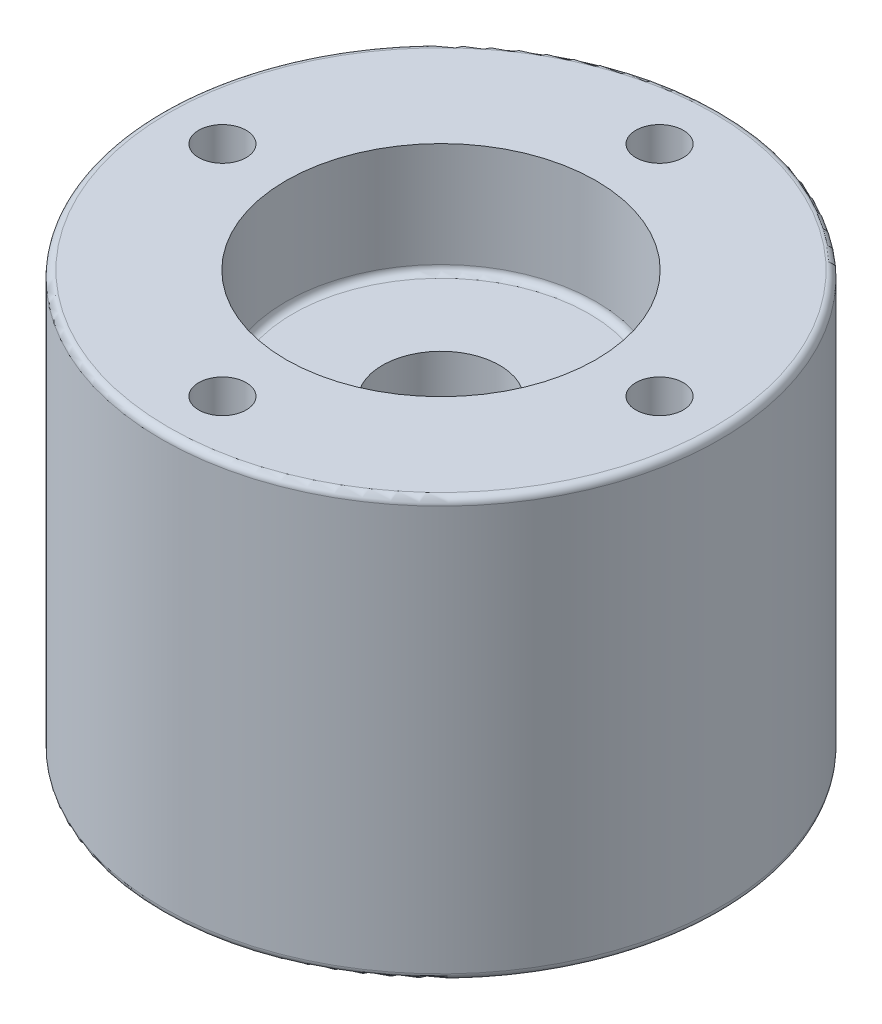
ISO-10303-21;
HEADER;
FILE_DESCRIPTION(('STEP AP214'),'2;1');
FILE_NAME('part.step','',(''),(''),'','','');
FILE_SCHEMA(('AUTOMOTIVE_DESIGN { 1 0 10303 214 1 1 1 1 }'));
ENDSEC;
DATA;
#1=APPLICATION_CONTEXT('core data for automotive mechanical design processes');
#2=APPLICATION_PROTOCOL_DEFINITION('international standard','automotive_design',2000,#1);
#3=PRODUCT_CONTEXT('',#1,'mechanical');
#4=PRODUCT('Part','Part','',(#3));
#5=PRODUCT_RELATED_PRODUCT_CATEGORY('part','',(#4));
#6=PRODUCT_DEFINITION_FORMATION('','',#4);
#7=PRODUCT_DEFINITION_CONTEXT('part definition',#1,'design');
#8=PRODUCT_DEFINITION('design','',#6,#7);
#9=PRODUCT_DEFINITION_SHAPE('','',#8);
#10=(LENGTH_UNIT() NAMED_UNIT(*) SI_UNIT(.MILLI.,.METRE.));
#11=(NAMED_UNIT(*) PLANE_ANGLE_UNIT() SI_UNIT($,.RADIAN.));
#12=(NAMED_UNIT(*) SI_UNIT($,.STERADIAN.) SOLID_ANGLE_UNIT());
#13=UNCERTAINTY_MEASURE_WITH_UNIT(LENGTH_MEASURE(1.E-05),#10,'distance_accuracy_value','');
#14=(GEOMETRIC_REPRESENTATION_CONTEXT(3) GLOBAL_UNCERTAINTY_ASSIGNED_CONTEXT((#13)) GLOBAL_UNIT_ASSIGNED_CONTEXT((#10,
#11,#12)) REPRESENTATION_CONTEXT('',''));
#15=CARTESIAN_POINT('',(0.,0.,0.));
#16=DIRECTION('',(0.,0.,1.));
#17=DIRECTION('',(1.,0.,0.));
#18=AXIS2_PLACEMENT_3D('',#15,#16,#17);
#19=CARTESIAN_POINT('',(0.,30.,0.));
#20=DIRECTION('',(0.,-1.,0.));
#21=DIRECTION('',(0.,0.,-1.));
#22=AXIS2_PLACEMENT_3D('',#19,#20,#21);
#23=CYLINDRICAL_SURFACE('',#22,20.);
#24=CARTESIAN_POINT('',(0.,0.5,0.));
#25=DIRECTION('',(0.,1.,0.));
#26=DIRECTION('',(0.,0.,1.));
#27=AXIS2_PLACEMENT_3D('',#24,#25,#26);
#28=CIRCLE('',#27,20.);
#29=CARTESIAN_POINT('',(0.,0.5,20.));
#30=VERTEX_POINT('',#29);
#31=EDGE_CURVE('E62',#30,#30,#28,.T.);
#32=ORIENTED_EDGE('',*,*,#31,.T.);
#33=EDGE_LOOP('',(#32));
#34=FACE_BOUND('',#33,.T.);
#35=CARTESIAN_POINT('',(0.,29.5,0.));
#36=DIRECTION('',(0.,1.,0.));
#37=DIRECTION('',(0.,0.,1.));
#38=AXIS2_PLACEMENT_3D('',#35,#36,#37);
#39=CIRCLE('',#38,20.);
#40=CARTESIAN_POINT('',(0.,29.5,20.));
#41=VERTEX_POINT('',#40);
#42=EDGE_CURVE('E65',#41,#41,#39,.F.);
#43=ORIENTED_EDGE('',*,*,#42,.T.);
#44=EDGE_LOOP('',(#43));
#45=FACE_BOUND('',#44,.T.);
#46=ADVANCED_FACE('F36',(#34,#45),#23,.T.);
#47=CARTESIAN_POINT('',(0.,30.,0.));
#48=DIRECTION('',(0.,1.,0.));
#49=DIRECTION('',(0.,0.,1.));
#50=AXIS2_PLACEMENT_3D('',#47,#48,#49);
#51=PLANE('',#50);
#52=CARTESIAN_POINT('',(0.,30.,0.));
#53=DIRECTION('',(0.,1.,0.));
#54=DIRECTION('',(0.,0.,1.));
#55=AXIS2_PLACEMENT_3D('',#52,#53,#54);
#56=CIRCLE('',#55,19.5);
#57=CARTESIAN_POINT('',(0.,30.,19.5));
#58=VERTEX_POINT('',#57);
#59=EDGE_CURVE('E51',#58,#58,#56,.T.);
#60=ORIENTED_EDGE('',*,*,#59,.T.);
#61=EDGE_LOOP('',(#60));
#62=FACE_BOUND('',#61,.T.);
#63=CARTESIAN_POINT('',(0.,30.,-15.65));
#64=DIRECTION('',(0.,1.,0.));
#65=DIRECTION('',(0.,0.,1.));
#66=AXIS2_PLACEMENT_3D('',#63,#64,#65);
#67=CIRCLE('',#66,1.7);
#68=CARTESIAN_POINT('',(0.,30.,-13.95));
#69=VERTEX_POINT('',#68);
#70=EDGE_CURVE('E100',#69,#69,#67,.T.);
#71=ORIENTED_EDGE('',*,*,#70,.F.);
#72=EDGE_LOOP('',(#71));
#73=FACE_BOUND('',#72,.T.);
#74=CARTESIAN_POINT('',(-15.65,30.,0.));
#75=DIRECTION('',(0.,1.,0.));
#76=DIRECTION('',(0.,0.,1.));
#77=AXIS2_PLACEMENT_3D('',#74,#75,#76);
#78=CIRCLE('',#77,1.7);
#79=CARTESIAN_POINT('',(-15.65,30.,1.7));
#80=VERTEX_POINT('',#79);
#81=EDGE_CURVE('E97',#80,#80,#78,.T.);
#82=ORIENTED_EDGE('',*,*,#81,.F.);
#83=EDGE_LOOP('',(#82));
#84=FACE_BOUND('',#83,.T.);
#85=CARTESIAN_POINT('',(0.,30.,15.65));
#86=DIRECTION('',(0.,1.,0.));
#87=DIRECTION('',(0.,0.,1.));
#88=AXIS2_PLACEMENT_3D('',#85,#86,#87);
#89=CIRCLE('',#88,1.7);
#90=CARTESIAN_POINT('',(0.,30.,17.35));
#91=VERTEX_POINT('',#90);
#92=EDGE_CURVE('E91',#91,#91,#89,.T.);
#93=ORIENTED_EDGE('',*,*,#92,.F.);
#94=EDGE_LOOP('',(#93));
#95=FACE_BOUND('',#94,.T.);
#96=CARTESIAN_POINT('',(15.65,30.,0.));
#97=DIRECTION('',(0.,1.,0.));
#98=DIRECTION('',(0.,0.,1.));
#99=AXIS2_PLACEMENT_3D('',#96,#97,#98);
#100=CIRCLE('',#99,1.7);
#101=CARTESIAN_POINT('',(15.65,30.,1.7));
#102=VERTEX_POINT('',#101);
#103=EDGE_CURVE('E85',#102,#102,#100,.T.);
#104=ORIENTED_EDGE('',*,*,#103,.F.);
#105=EDGE_LOOP('',(#104));
#106=FACE_BOUND('',#105,.T.);
#107=CARTESIAN_POINT('',(0.,30.,0.));
#108=DIRECTION('',(0.,1.,0.));
#109=DIRECTION('',(0.,0.,1.));
#110=AXIS2_PLACEMENT_3D('',#107,#108,#109);
#111=CIRCLE('',#110,11.1);
#112=CARTESIAN_POINT('',(0.,30.,11.1));
#113=VERTEX_POINT('',#112);
#114=EDGE_CURVE('E74',#113,#113,#111,.T.);
#115=ORIENTED_EDGE('',*,*,#114,.F.);
#116=EDGE_LOOP('',(#115));
#117=FACE_BOUND('',#116,.T.);
#118=ADVANCED_FACE('F127',(#62,#73,#84,#95,#106,#117),#51,.T.);
#119=CARTESIAN_POINT('',(0.,0.,0.));
#120=DIRECTION('',(0.,1.,0.));
#121=DIRECTION('',(0.,0.,1.));
#122=AXIS2_PLACEMENT_3D('',#119,#120,#121);
#123=PLANE('',#122);
#124=CARTESIAN_POINT('',(0.,0.,0.));
#125=DIRECTION('',(0.,1.,0.));
#126=DIRECTION('',(0.,0.,1.));
#127=AXIS2_PLACEMENT_3D('',#124,#125,#126);
#128=CIRCLE('',#127,19.5);
#129=CARTESIAN_POINT('',(0.,0.,19.5));
#130=VERTEX_POINT('',#129);
#131=EDGE_CURVE('E56',#130,#130,#128,.F.);
#132=ORIENTED_EDGE('',*,*,#131,.T.);
#133=EDGE_LOOP('',(#132));
#134=FACE_BOUND('',#133,.T.);
#135=CARTESIAN_POINT('',(0.,0.,0.));
#136=DIRECTION('',(0.,1.,0.));
#137=DIRECTION('',(0.,0.,1.));
#138=AXIS2_PLACEMENT_3D('',#135,#136,#137);
#139=CIRCLE('',#138,11.6);
#140=CARTESIAN_POINT('',(0.,0.,11.6));
#141=VERTEX_POINT('',#140);
#142=EDGE_CURVE('E59',#141,#141,#139,.T.);
#143=ORIENTED_EDGE('',*,*,#142,.T.);
#144=EDGE_LOOP('',(#143));
#145=FACE_BOUND('',#144,.T.);
#146=CARTESIAN_POINT('',(0.,0.,-15.65));
#147=DIRECTION('',(0.,1.,0.));
#148=DIRECTION('',(0.,0.,1.));
#149=AXIS2_PLACEMENT_3D('',#146,#147,#148);
#150=CIRCLE('',#149,1.7);
#151=CARTESIAN_POINT('',(0.,0.,-13.95));
#152=VERTEX_POINT('',#151);
#153=EDGE_CURVE('E82',#152,#152,#150,.T.);
#154=ORIENTED_EDGE('',*,*,#153,.T.);
#155=EDGE_LOOP('',(#154));
#156=FACE_BOUND('',#155,.T.);
#157=CARTESIAN_POINT('',(-15.65,0.,0.));
#158=DIRECTION('',(0.,1.,0.));
#159=DIRECTION('',(0.,0.,1.));
#160=AXIS2_PLACEMENT_3D('',#157,#158,#159);
#161=CIRCLE('',#160,1.7);
#162=CARTESIAN_POINT('',(-15.65,0.,1.7));
#163=VERTEX_POINT('',#162);
#164=EDGE_CURVE('E94',#163,#163,#161,.T.);
#165=ORIENTED_EDGE('',*,*,#164,.T.);
#166=EDGE_LOOP('',(#165));
#167=FACE_BOUND('',#166,.T.);
#168=CARTESIAN_POINT('',(0.,0.,15.65));
#169=DIRECTION('',(0.,1.,0.));
#170=DIRECTION('',(0.,0.,1.));
#171=AXIS2_PLACEMENT_3D('',#168,#169,#170);
#172=CIRCLE('',#171,1.7);
#173=CARTESIAN_POINT('',(0.,0.,17.35));
#174=VERTEX_POINT('',#173);
#175=EDGE_CURVE('E88',#174,#174,#172,.T.);
#176=ORIENTED_EDGE('',*,*,#175,.T.);
#177=EDGE_LOOP('',(#176));
#178=FACE_BOUND('',#177,.T.);
#179=CARTESIAN_POINT('',(15.65,0.,0.));
#180=DIRECTION('',(0.,1.,0.));
#181=DIRECTION('',(0.,0.,1.));
#182=AXIS2_PLACEMENT_3D('',#179,#180,#181);
#183=CIRCLE('',#182,1.7);
#184=CARTESIAN_POINT('',(15.65,0.,1.7));
#185=VERTEX_POINT('',#184);
#186=EDGE_CURVE('E78',#185,#185,#183,.T.);
#187=ORIENTED_EDGE('',*,*,#186,.T.);
#188=EDGE_LOOP('',(#187));
#189=FACE_BOUND('',#188,.T.);
#190=ADVANCED_FACE('F123',(#134,#145,#156,#167,#178,#189),#123,.F.);
#191=CARTESIAN_POINT('',(0.,22.,0.));
#192=DIRECTION('',(0.,1.,0.));
#193=DIRECTION('',(0.,0.,1.));
#194=AXIS2_PLACEMENT_3D('',#191,#192,#193);
#195=CYLINDRICAL_SURFACE('',#194,11.1);
#196=CARTESIAN_POINT('',(0.,22.5,0.));
#197=DIRECTION('',(0.,1.,0.));
#198=DIRECTION('',(0.,0.,1.));
#199=AXIS2_PLACEMENT_3D('',#196,#197,#198);
#200=CIRCLE('',#199,11.1);
#201=CARTESIAN_POINT('',(0.,22.5,11.1));
#202=VERTEX_POINT('',#201);
#203=EDGE_CURVE('E68',#202,#202,#200,.F.);
#204=ORIENTED_EDGE('',*,*,#203,.T.);
#205=EDGE_LOOP('',(#204));
#206=FACE_BOUND('',#205,.T.);
#207=ORIENTED_EDGE('',*,*,#114,.T.);
#208=EDGE_LOOP('',(#207));
#209=FACE_BOUND('',#208,.T.);
#210=ADVANCED_FACE('F113',(#206,#209),#195,.F.);
#211=CARTESIAN_POINT('',(0.,22.,0.));
#212=DIRECTION('',(0.,1.,0.));
#213=DIRECTION('',(0.,0.,1.));
#214=AXIS2_PLACEMENT_3D('',#211,#212,#213);
#215=PLANE('',#214);
#216=CARTESIAN_POINT('',(0.,22.,0.));
#217=DIRECTION('',(0.,1.,0.));
#218=DIRECTION('',(0.,0.,1.));
#219=AXIS2_PLACEMENT_3D('',#216,#217,#218);
#220=CIRCLE('',#219,10.6);
#221=CARTESIAN_POINT('',(0.,22.,10.6));
#222=VERTEX_POINT('',#221);
#223=EDGE_CURVE('E71',#222,#222,#220,.T.);
#224=ORIENTED_EDGE('',*,*,#223,.T.);
#225=EDGE_LOOP('',(#224));
#226=FACE_BOUND('',#225,.T.);
#227=CARTESIAN_POINT('',(0.,22.,0.));
#228=DIRECTION('',(0.,1.,0.));
#229=DIRECTION('',(0.,0.,1.));
#230=AXIS2_PLACEMENT_3D('',#227,#228,#229);
#231=CIRCLE('',#230,4.2);
#232=CARTESIAN_POINT('',(0.,22.,4.2));
#233=VERTEX_POINT('',#232);
#234=EDGE_CURVE('E79',#233,#233,#231,.T.);
#235=ORIENTED_EDGE('',*,*,#234,.F.);
#236=EDGE_LOOP('',(#235));
#237=FACE_BOUND('',#236,.T.);
#238=ADVANCED_FACE('F110',(#226,#237),#215,.T.);
#239=CARTESIAN_POINT('',(0.,8.,0.));
#240=DIRECTION('',(0.,-1.,0.));
#241=DIRECTION('',(0.,0.,-1.));
#242=AXIS2_PLACEMENT_3D('',#239,#240,#241);
#243=CYLINDRICAL_SURFACE('',#242,11.1);
#244=CARTESIAN_POINT('',(0.,0.5,0.));
#245=DIRECTION('',(0.,1.,0.));
#246=DIRECTION('',(0.,0.,1.));
#247=AXIS2_PLACEMENT_3D('',#244,#245,#246);
#248=CIRCLE('',#247,11.1);
#249=CARTESIAN_POINT('',(0.,0.5,11.1));
#250=VERTEX_POINT('',#249);
#251=EDGE_CURVE('E43',#250,#250,#248,.F.);
#252=ORIENTED_EDGE('',*,*,#251,.T.);
#253=EDGE_LOOP('',(#252));
#254=FACE_BOUND('',#253,.T.);
#255=CARTESIAN_POINT('',(0.,7.5,0.));
#256=DIRECTION('',(0.,-1.,0.));
#257=DIRECTION('',(0.,0.,-1.));
#258=AXIS2_PLACEMENT_3D('',#255,#256,#257);
#259=CIRCLE('',#258,11.1);
#260=CARTESIAN_POINT('',(0.,7.5,-11.1));
#261=VERTEX_POINT('',#260);
#262=EDGE_CURVE('E47',#261,#261,#259,.F.);
#263=ORIENTED_EDGE('',*,*,#262,.T.);
#264=EDGE_LOOP('',(#263));
#265=FACE_BOUND('',#264,.T.);
#266=ADVANCED_FACE('F112',(#254,#265),#243,.F.);
#267=CARTESIAN_POINT('',(0.,8.,0.));
#268=DIRECTION('',(0.,-1.,0.));
#269=DIRECTION('',(0.,0.,-1.));
#270=AXIS2_PLACEMENT_3D('',#267,#268,#269);
#271=PLANE('',#270);
#272=CARTESIAN_POINT('',(0.,8.,0.));
#273=DIRECTION('',(0.,-1.,0.));
#274=DIRECTION('',(0.,0.,-1.));
#275=AXIS2_PLACEMENT_3D('',#272,#273,#274);
#276=CIRCLE('',#275,10.6);
#277=CARTESIAN_POINT('',(0.,8.,-10.6));
#278=VERTEX_POINT('',#277);
#279=EDGE_CURVE('E10',#278,#278,#276,.T.);
#280=ORIENTED_EDGE('',*,*,#279,.T.);
#281=EDGE_LOOP('',(#280));
#282=FACE_BOUND('',#281,.T.);
#283=CARTESIAN_POINT('',(0.,8.,0.));
#284=DIRECTION('',(0.,-1.,0.));
#285=DIRECTION('',(0.,0.,-1.));
#286=AXIS2_PLACEMENT_3D('',#283,#284,#285);
#287=CIRCLE('',#286,4.2);
#288=CARTESIAN_POINT('',(0.,8.,-4.2));
#289=VERTEX_POINT('',#288);
#290=EDGE_CURVE('E75',#289,#289,#287,.T.);
#291=ORIENTED_EDGE('',*,*,#290,.F.);
#292=EDGE_LOOP('',(#291));
#293=FACE_BOUND('',#292,.T.);
#294=ADVANCED_FACE('F121',(#282,#293),#271,.T.);
#295=CARTESIAN_POINT('',(15.65,0.,0.));
#296=DIRECTION('',(0.,1.,0.));
#297=DIRECTION('',(0.,0.,1.));
#298=AXIS2_PLACEMENT_3D('',#295,#296,#297);
#299=CYLINDRICAL_SURFACE('',#298,1.7);
#300=ORIENTED_EDGE('',*,*,#186,.F.);
#301=EDGE_LOOP('',(#300));
#302=FACE_BOUND('',#301,.T.);
#303=ORIENTED_EDGE('',*,*,#103,.T.);
#304=EDGE_LOOP('',(#303));
#305=FACE_BOUND('',#304,.T.);
#306=ADVANCED_FACE('F169',(#302,#305),#299,.F.);
#307=CARTESIAN_POINT('',(0.,0.,15.65));
#308=DIRECTION('',(0.,1.,0.));
#309=DIRECTION('',(0.,0.,1.));
#310=AXIS2_PLACEMENT_3D('',#307,#308,#309);
#311=CYLINDRICAL_SURFACE('',#310,1.7);
#312=ORIENTED_EDGE('',*,*,#175,.F.);
#313=EDGE_LOOP('',(#312));
#314=FACE_BOUND('',#313,.T.);
#315=ORIENTED_EDGE('',*,*,#92,.T.);
#316=EDGE_LOOP('',(#315));
#317=FACE_BOUND('',#316,.T.);
#318=ADVANCED_FACE('F172',(#314,#317),#311,.F.);
#319=CARTESIAN_POINT('',(-15.65,0.,0.));
#320=DIRECTION('',(0.,1.,0.));
#321=DIRECTION('',(0.,0.,1.));
#322=AXIS2_PLACEMENT_3D('',#319,#320,#321);
#323=CYLINDRICAL_SURFACE('',#322,1.7);
#324=ORIENTED_EDGE('',*,*,#164,.F.);
#325=EDGE_LOOP('',(#324));
#326=FACE_BOUND('',#325,.T.);
#327=ORIENTED_EDGE('',*,*,#81,.T.);
#328=EDGE_LOOP('',(#327));
#329=FACE_BOUND('',#328,.T.);
#330=ADVANCED_FACE('F182',(#326,#329),#323,.F.);
#331=CARTESIAN_POINT('',(0.,0.,-15.65));
#332=DIRECTION('',(0.,1.,0.));
#333=DIRECTION('',(0.,0.,1.));
#334=AXIS2_PLACEMENT_3D('',#331,#332,#333);
#335=CYLINDRICAL_SURFACE('',#334,1.7);
#336=ORIENTED_EDGE('',*,*,#153,.F.);
#337=EDGE_LOOP('',(#336));
#338=FACE_BOUND('',#337,.T.);
#339=ORIENTED_EDGE('',*,*,#70,.T.);
#340=EDGE_LOOP('',(#339));
#341=FACE_BOUND('',#340,.T.);
#342=ADVANCED_FACE('F190',(#338,#341),#335,.F.);
#343=CARTESIAN_POINT('',(0.,0.,0.));
#344=DIRECTION('',(0.,1.,0.));
#345=DIRECTION('',(0.,0.,1.));
#346=AXIS2_PLACEMENT_3D('',#343,#344,#345);
#347=CYLINDRICAL_SURFACE('',#346,4.2);
#348=ORIENTED_EDGE('',*,*,#290,.T.);
#349=EDGE_LOOP('',(#348));
#350=FACE_BOUND('',#349,.T.);
#351=ORIENTED_EDGE('',*,*,#234,.T.);
#352=EDGE_LOOP('',(#351));
#353=FACE_BOUND('',#352,.T.);
#354=ADVANCED_FACE('F108',(#350,#353),#347,.F.);
#355=CARTESIAN_POINT('',(0.,22.5,0.));
#356=DIRECTION('',(0.,1.,0.));
#357=DIRECTION('',(0.,0.,1.));
#358=AXIS2_PLACEMENT_3D('',#355,#356,#357);
#359=TOROIDAL_SURFACE('',#358,10.6,0.5);
#360=ORIENTED_EDGE('',*,*,#203,.F.);
#361=EDGE_LOOP('',(#360));
#362=FACE_BOUND('',#361,.T.);
#363=ORIENTED_EDGE('',*,*,#223,.F.);
#364=EDGE_LOOP('',(#363));
#365=FACE_BOUND('',#364,.T.);
#366=ADVANCED_FACE('F138',(#362,#365),#359,.F.);
#367=CARTESIAN_POINT('',(0.,0.5,0.));
#368=DIRECTION('',(0.,1.,0.));
#369=DIRECTION('',(0.,0.,1.));
#370=AXIS2_PLACEMENT_3D('',#367,#368,#369);
#371=TOROIDAL_SURFACE('',#370,19.5,0.5);
#372=ORIENTED_EDGE('',*,*,#131,.F.);
#373=EDGE_LOOP('',(#372));
#374=FACE_BOUND('',#373,.T.);
#375=ORIENTED_EDGE('',*,*,#31,.F.);
#376=EDGE_LOOP('',(#375));
#377=FACE_BOUND('',#376,.T.);
#378=ADVANCED_FACE('F140',(#374,#377),#371,.T.);
#379=CARTESIAN_POINT('',(0.,29.5,0.));
#380=DIRECTION('',(0.,1.,0.));
#381=DIRECTION('',(0.,0.,1.));
#382=AXIS2_PLACEMENT_3D('',#379,#380,#381);
#383=TOROIDAL_SURFACE('',#382,19.5,0.5);
#384=ORIENTED_EDGE('',*,*,#42,.F.);
#385=EDGE_LOOP('',(#384));
#386=FACE_BOUND('',#385,.T.);
#387=ORIENTED_EDGE('',*,*,#59,.F.);
#388=EDGE_LOOP('',(#387));
#389=FACE_BOUND('',#388,.T.);
#390=ADVANCED_FACE('F144',(#386,#389),#383,.T.);
#391=CARTESIAN_POINT('',(0.,0.5,0.));
#392=DIRECTION('',(0.,1.,0.));
#393=DIRECTION('',(0.,0.,1.));
#394=AXIS2_PLACEMENT_3D('',#391,#392,#393);
#395=TOROIDAL_SURFACE('',#394,11.6,0.5);
#396=ORIENTED_EDGE('',*,*,#142,.F.);
#397=EDGE_LOOP('',(#396));
#398=FACE_BOUND('',#397,.T.);
#399=ORIENTED_EDGE('',*,*,#251,.F.);
#400=EDGE_LOOP('',(#399));
#401=FACE_BOUND('',#400,.T.);
#402=ADVANCED_FACE('F147',(#398,#401),#395,.T.);
#403=CARTESIAN_POINT('',(0.,7.5,0.));
#404=DIRECTION('',(0.,-1.,0.));
#405=DIRECTION('',(0.,0.,-1.));
#406=AXIS2_PLACEMENT_3D('',#403,#404,#405);
#407=TOROIDAL_SURFACE('',#406,10.6,0.5);
#408=ORIENTED_EDGE('',*,*,#262,.F.);
#409=EDGE_LOOP('',(#408));
#410=FACE_BOUND('',#409,.T.);
#411=ORIENTED_EDGE('',*,*,#279,.F.);
#412=EDGE_LOOP('',(#411));
#413=FACE_BOUND('',#412,.T.);
#414=ADVANCED_FACE('F38',(#410,#413),#407,.F.);
#415=CLOSED_SHELL('',(#46,#118,#190,#210,#238,#266,#294,#306,#318,#330,#342,#354,#366,#378,#390,
#402,#414));
#416=MANIFOLD_SOLID_BREP('B2',#415);
#417=ADVANCED_BREP_SHAPE_REPRESENTATION('',(#18,#416),#14);
#418=SHAPE_DEFINITION_REPRESENTATION(#9,#417);
ENDSEC;
END-ISO-10303-21;
